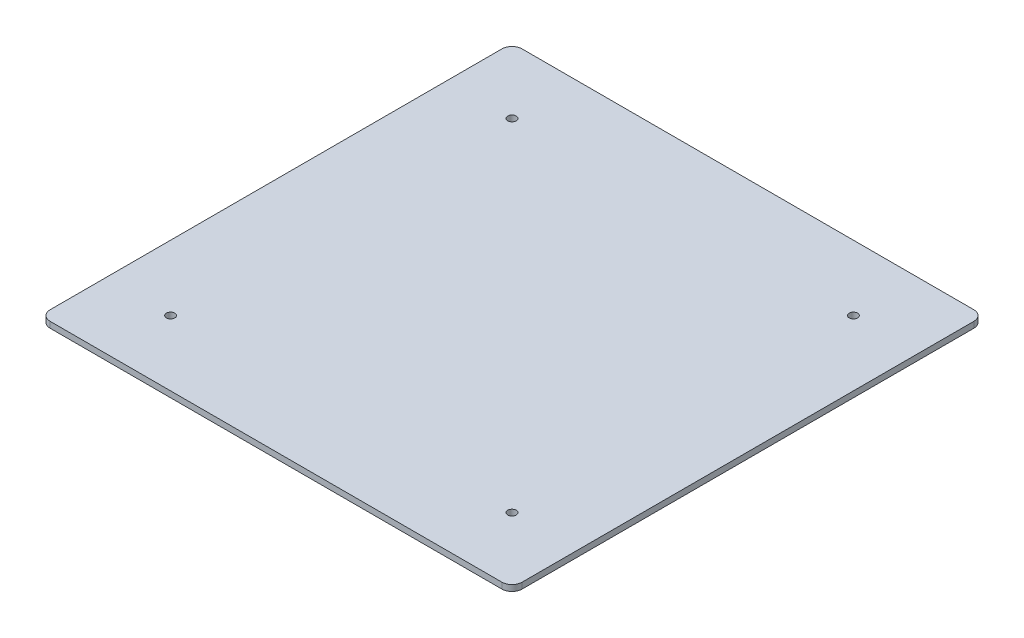
ISO-10303-21;
HEADER;
FILE_DESCRIPTION(('STEP AP214'),'2;1');
FILE_NAME('part.step','',(''),(''),'','','');
FILE_SCHEMA(('AUTOMOTIVE_DESIGN { 1 0 10303 214 1 1 1 1 }'));
ENDSEC;
DATA;
#1=APPLICATION_CONTEXT('core data for automotive mechanical design processes');
#2=APPLICATION_PROTOCOL_DEFINITION('international standard','automotive_design',2000,#1);
#3=PRODUCT_CONTEXT('',#1,'mechanical');
#4=PRODUCT('Part','Part','',(#3));
#5=PRODUCT_RELATED_PRODUCT_CATEGORY('part','',(#4));
#6=PRODUCT_DEFINITION_FORMATION('','',#4);
#7=PRODUCT_DEFINITION_CONTEXT('part definition',#1,'design');
#8=PRODUCT_DEFINITION('design','',#6,#7);
#9=PRODUCT_DEFINITION_SHAPE('','',#8);
#10=(LENGTH_UNIT() NAMED_UNIT(*) SI_UNIT(.MILLI.,.METRE.));
#11=(NAMED_UNIT(*) PLANE_ANGLE_UNIT() SI_UNIT($,.RADIAN.));
#12=(NAMED_UNIT(*) SI_UNIT($,.STERADIAN.) SOLID_ANGLE_UNIT());
#13=UNCERTAINTY_MEASURE_WITH_UNIT(LENGTH_MEASURE(1.E-05),#10,'distance_accuracy_value','');
#14=(GEOMETRIC_REPRESENTATION_CONTEXT(3) GLOBAL_UNCERTAINTY_ASSIGNED_CONTEXT((#13)) GLOBAL_UNIT_ASSIGNED_CONTEXT((#10,
#11,#12)) REPRESENTATION_CONTEXT('',''));
#15=CARTESIAN_POINT('',(0.,0.,0.));
#16=DIRECTION('',(0.,0.,1.));
#17=DIRECTION('',(1.,0.,0.));
#18=AXIS2_PLACEMENT_3D('',#15,#16,#17);
#19=CARTESIAN_POINT('',(0.,3.,117.5));
#20=DIRECTION('',(0.,0.,-1.));
#21=DIRECTION('',(-1.,0.,0.));
#22=AXIS2_PLACEMENT_3D('',#19,#20,#21);
#23=PLANE('',#22);
#24=DIRECTION('',(1.,0.,0.));
#25=VECTOR('',#24,1.);
#26=CARTESIAN_POINT('',(0.,3.,117.5));
#27=LINE('',#26,#25);
#28=CARTESIAN_POINT('',(-112.5,3.,117.5));
#29=VERTEX_POINT('',#28);
#30=CARTESIAN_POINT('',(112.5,3.,117.5));
#31=VERTEX_POINT('',#30);
#32=EDGE_CURVE('E125',#29,#31,#27,.T.);
#33=ORIENTED_EDGE('',*,*,#32,.F.);
#34=DIRECTION('',(0.,-1.,0.));
#35=VECTOR('',#34,1.);
#36=CARTESIAN_POINT('',(-112.5,0.,117.5));
#37=LINE('',#36,#35);
#38=CARTESIAN_POINT('',(-112.5,0.,117.5));
#39=VERTEX_POINT('',#38);
#40=EDGE_CURVE('E110',#29,#39,#37,.T.);
#41=ORIENTED_EDGE('',*,*,#40,.T.);
#42=DIRECTION('',(1.,0.,0.));
#43=VECTOR('',#42,1.);
#44=CARTESIAN_POINT('',(0.,0.,117.5));
#45=LINE('',#44,#43);
#46=CARTESIAN_POINT('',(112.5,0.,117.5));
#47=VERTEX_POINT('',#46);
#48=EDGE_CURVE('E122',#39,#47,#45,.T.);
#49=ORIENTED_EDGE('',*,*,#48,.T.);
#50=DIRECTION('',(0.,-1.,0.));
#51=VECTOR('',#50,1.);
#52=CARTESIAN_POINT('',(112.5,3.,117.5));
#53=LINE('',#52,#51);
#54=EDGE_CURVE('E127',#47,#31,#53,.F.);
#55=ORIENTED_EDGE('',*,*,#54,.T.);
#56=EDGE_LOOP('',(#33,#41,#49,#55));
#57=FACE_BOUND('',#56,.T.);
#58=ADVANCED_FACE('F40',(#57),#23,.F.);
#59=CARTESIAN_POINT('',(117.5,3.,0.));
#60=DIRECTION('',(-1.,0.,0.));
#61=DIRECTION('',(0.,0.,1.));
#62=AXIS2_PLACEMENT_3D('',#59,#60,#61);
#63=PLANE('',#62);
#64=DIRECTION('',(0.,0.,-1.));
#65=VECTOR('',#64,1.);
#66=CARTESIAN_POINT('',(117.5,0.,0.));
#67=LINE('',#66,#65);
#68=CARTESIAN_POINT('',(117.5,0.,112.5));
#69=VERTEX_POINT('',#68);
#70=CARTESIAN_POINT('',(117.5,0.,-112.5));
#71=VERTEX_POINT('',#70);
#72=EDGE_CURVE('E131',#69,#71,#67,.T.);
#73=ORIENTED_EDGE('',*,*,#72,.T.);
#74=DIRECTION('',(0.,-1.,0.));
#75=VECTOR('',#74,1.);
#76=CARTESIAN_POINT('',(117.5,3.,-112.5));
#77=LINE('',#76,#75);
#78=CARTESIAN_POINT('',(117.5,3.,-112.5));
#79=VERTEX_POINT('',#78);
#80=EDGE_CURVE('E11',#71,#79,#77,.F.);
#81=ORIENTED_EDGE('',*,*,#80,.T.);
#82=DIRECTION('',(0.,0.,-1.));
#83=VECTOR('',#82,1.);
#84=CARTESIAN_POINT('',(117.5,3.,0.));
#85=LINE('',#84,#83);
#86=CARTESIAN_POINT('',(117.5,3.,112.5));
#87=VERTEX_POINT('',#86);
#88=EDGE_CURVE('E172',#87,#79,#85,.T.);
#89=ORIENTED_EDGE('',*,*,#88,.F.);
#90=DIRECTION('',(0.,-1.,0.));
#91=VECTOR('',#90,1.);
#92=CARTESIAN_POINT('',(117.5,3.,112.5));
#93=LINE('',#92,#91);
#94=EDGE_CURVE('E48',#87,#69,#93,.T.);
#95=ORIENTED_EDGE('',*,*,#94,.T.);
#96=EDGE_LOOP('',(#73,#81,#89,#95));
#97=FACE_BOUND('',#96,.T.);
#98=ADVANCED_FACE('F170',(#97),#63,.F.);
#99=CARTESIAN_POINT('',(0.,3.,-117.5));
#100=DIRECTION('',(0.,0.,-1.));
#101=DIRECTION('',(-1.,0.,0.));
#102=AXIS2_PLACEMENT_3D('',#99,#100,#101);
#103=PLANE('',#102);
#104=DIRECTION('',(1.,0.,0.));
#105=VECTOR('',#104,1.);
#106=CARTESIAN_POINT('',(0.,0.,-117.5));
#107=LINE('',#106,#105);
#108=CARTESIAN_POINT('',(-112.5,0.,-117.5));
#109=VERTEX_POINT('',#108);
#110=CARTESIAN_POINT('',(112.5,0.,-117.5));
#111=VERTEX_POINT('',#110);
#112=EDGE_CURVE('E135',#109,#111,#107,.T.);
#113=ORIENTED_EDGE('',*,*,#112,.F.);
#114=DIRECTION('',(0.,-1.,0.));
#115=VECTOR('',#114,1.);
#116=CARTESIAN_POINT('',(-112.5,3.,-117.5));
#117=LINE('',#116,#115);
#118=CARTESIAN_POINT('',(-112.5,3.,-117.5));
#119=VERTEX_POINT('',#118);
#120=EDGE_CURVE('E62',#109,#119,#117,.F.);
#121=ORIENTED_EDGE('',*,*,#120,.T.);
#122=DIRECTION('',(1.,0.,0.));
#123=VECTOR('',#122,1.);
#124=CARTESIAN_POINT('',(0.,3.,-117.5));
#125=LINE('',#124,#123);
#126=CARTESIAN_POINT('',(112.5,3.,-117.5));
#127=VERTEX_POINT('',#126);
#128=EDGE_CURVE('E179',#119,#127,#125,.T.);
#129=ORIENTED_EDGE('',*,*,#128,.T.);
#130=DIRECTION('',(0.,-1.,0.));
#131=VECTOR('',#130,1.);
#132=CARTESIAN_POINT('',(112.5,0.,-117.5));
#133=LINE('',#132,#131);
#134=EDGE_CURVE('E163',#127,#111,#133,.T.);
#135=ORIENTED_EDGE('',*,*,#134,.T.);
#136=EDGE_LOOP('',(#113,#121,#129,#135));
#137=FACE_BOUND('',#136,.T.);
#138=ADVANCED_FACE('F178',(#137),#103,.T.);
#139=CARTESIAN_POINT('',(-117.5,3.,0.));
#140=DIRECTION('',(-1.,0.,0.));
#141=DIRECTION('',(0.,0.,1.));
#142=AXIS2_PLACEMENT_3D('',#139,#140,#141);
#143=PLANE('',#142);
#144=DIRECTION('',(0.,0.,-1.));
#145=VECTOR('',#144,1.);
#146=CARTESIAN_POINT('',(-117.5,0.,0.));
#147=LINE('',#146,#145);
#148=CARTESIAN_POINT('',(-117.5,0.,112.5));
#149=VERTEX_POINT('',#148);
#150=CARTESIAN_POINT('',(-117.5,0.,-112.5));
#151=VERTEX_POINT('',#150);
#152=EDGE_CURVE('E146',#149,#151,#147,.T.);
#153=ORIENTED_EDGE('',*,*,#152,.F.);
#154=DIRECTION('',(0.,-1.,0.));
#155=VECTOR('',#154,1.);
#156=CARTESIAN_POINT('',(-117.5,3.,112.5));
#157=LINE('',#156,#155);
#158=CARTESIAN_POINT('',(-117.5,3.,112.5));
#159=VERTEX_POINT('',#158);
#160=EDGE_CURVE('E111',#149,#159,#157,.F.);
#161=ORIENTED_EDGE('',*,*,#160,.T.);
#162=DIRECTION('',(0.,0.,-1.));
#163=VECTOR('',#162,1.);
#164=CARTESIAN_POINT('',(-117.5,3.,0.));
#165=LINE('',#164,#163);
#166=CARTESIAN_POINT('',(-117.5,3.,-112.5));
#167=VERTEX_POINT('',#166);
#168=EDGE_CURVE('E141',#159,#167,#165,.T.);
#169=ORIENTED_EDGE('',*,*,#168,.T.);
#170=DIRECTION('',(0.,-1.,0.));
#171=VECTOR('',#170,1.);
#172=CARTESIAN_POINT('',(-117.5,3.,-112.5));
#173=LINE('',#172,#171);
#174=EDGE_CURVE('E116',#167,#151,#173,.T.);
#175=ORIENTED_EDGE('',*,*,#174,.T.);
#176=EDGE_LOOP('',(#153,#161,#169,#175));
#177=FACE_BOUND('',#176,.T.);
#178=ADVANCED_FACE('F251',(#177),#143,.T.);
#179=CARTESIAN_POINT('',(0.,3.,0.));
#180=DIRECTION('',(0.,1.,0.));
#181=DIRECTION('',(0.,0.,1.));
#182=AXIS2_PLACEMENT_3D('',#179,#180,#181);
#183=PLANE('',#182);
#184=CARTESIAN_POINT('',(-85.,3.,-85.));
#185=DIRECTION('',(0.,-1.,0.));
#186=DIRECTION('',(0.,0.,-1.));
#187=AXIS2_PLACEMENT_3D('',#184,#185,#186);
#188=CIRCLE('',#187,2.1);
#189=CARTESIAN_POINT('',(-85.,3.,-87.1));
#190=VERTEX_POINT('',#189);
#191=EDGE_CURVE('E188',#190,#190,#188,.T.);
#192=ORIENTED_EDGE('',*,*,#191,.T.);
#193=EDGE_LOOP('',(#192));
#194=FACE_BOUND('',#193,.T.);
#195=CARTESIAN_POINT('',(85.,3.,85.));
#196=DIRECTION('',(0.,-1.,0.));
#197=DIRECTION('',(0.,0.,-1.));
#198=AXIS2_PLACEMENT_3D('',#195,#196,#197);
#199=CIRCLE('',#198,2.1);
#200=CARTESIAN_POINT('',(85.,3.,82.9));
#201=VERTEX_POINT('',#200);
#202=EDGE_CURVE('E194',#201,#201,#199,.T.);
#203=ORIENTED_EDGE('',*,*,#202,.T.);
#204=EDGE_LOOP('',(#203));
#205=FACE_BOUND('',#204,.T.);
#206=CARTESIAN_POINT('',(-85.,3.,85.));
#207=DIRECTION('',(0.,-1.,0.));
#208=DIRECTION('',(0.,0.,-1.));
#209=AXIS2_PLACEMENT_3D('',#206,#207,#208);
#210=CIRCLE('',#209,2.1);
#211=CARTESIAN_POINT('',(-85.,3.,82.9));
#212=VERTEX_POINT('',#211);
#213=EDGE_CURVE('E200',#212,#212,#210,.T.);
#214=ORIENTED_EDGE('',*,*,#213,.T.);
#215=EDGE_LOOP('',(#214));
#216=FACE_BOUND('',#215,.T.);
#217=CARTESIAN_POINT('',(85.,3.,-85.));
#218=DIRECTION('',(0.,-1.,0.));
#219=DIRECTION('',(0.,0.,-1.));
#220=AXIS2_PLACEMENT_3D('',#217,#218,#219);
#221=CIRCLE('',#220,2.1);
#222=CARTESIAN_POINT('',(85.,3.,-87.1));
#223=VERTEX_POINT('',#222);
#224=EDGE_CURVE('E132',#223,#223,#221,.T.);
#225=ORIENTED_EDGE('',*,*,#224,.T.);
#226=EDGE_LOOP('',(#225));
#227=FACE_BOUND('',#226,.T.);
#228=ORIENTED_EDGE('',*,*,#168,.F.);
#229=CARTESIAN_POINT('',(-112.5,3.,112.5));
#230=DIRECTION('',(0.,1.,0.));
#231=DIRECTION('',(0.,0.,1.));
#232=AXIS2_PLACEMENT_3D('',#229,#230,#231);
#233=CIRCLE('',#232,5.);
#234=EDGE_CURVE('E161',#159,#29,#233,.T.);
#235=ORIENTED_EDGE('',*,*,#234,.T.);
#236=ORIENTED_EDGE('',*,*,#32,.T.);
#237=CARTESIAN_POINT('',(112.5,3.,112.5));
#238=DIRECTION('',(0.,1.,0.));
#239=DIRECTION('',(0.,0.,1.));
#240=AXIS2_PLACEMENT_3D('',#237,#238,#239);
#241=CIRCLE('',#240,5.);
#242=EDGE_CURVE('E156',#31,#87,#241,.T.);
#243=ORIENTED_EDGE('',*,*,#242,.T.);
#244=ORIENTED_EDGE('',*,*,#88,.T.);
#245=CARTESIAN_POINT('',(112.5,3.,-112.5));
#246=DIRECTION('',(0.,1.,0.));
#247=DIRECTION('',(0.,0.,1.));
#248=AXIS2_PLACEMENT_3D('',#245,#246,#247);
#249=CIRCLE('',#248,5.);
#250=EDGE_CURVE('E55',#79,#127,#249,.T.);
#251=ORIENTED_EDGE('',*,*,#250,.T.);
#252=ORIENTED_EDGE('',*,*,#128,.F.);
#253=CARTESIAN_POINT('',(-112.5,3.,-112.5));
#254=DIRECTION('',(0.,1.,0.));
#255=DIRECTION('',(0.,0.,1.));
#256=AXIS2_PLACEMENT_3D('',#253,#254,#255);
#257=CIRCLE('',#256,5.);
#258=EDGE_CURVE('E159',#119,#167,#257,.T.);
#259=ORIENTED_EDGE('',*,*,#258,.T.);
#260=EDGE_LOOP('',(#228,#235,#236,#243,#244,#251,#252,#259));
#261=FACE_BOUND('',#260,.T.);
#262=ADVANCED_FACE('F211',(#194,#205,#216,#227,#261),#183,.T.);
#263=CARTESIAN_POINT('',(0.,0.,0.));
#264=DIRECTION('',(0.,1.,0.));
#265=DIRECTION('',(0.,0.,1.));
#266=AXIS2_PLACEMENT_3D('',#263,#264,#265);
#267=PLANE('',#266);
#268=CARTESIAN_POINT('',(-85.,0.,-85.));
#269=DIRECTION('',(0.,-1.,0.));
#270=DIRECTION('',(0.,0.,-1.));
#271=AXIS2_PLACEMENT_3D('',#268,#269,#270);
#272=CIRCLE('',#271,2.1);
#273=CARTESIAN_POINT('',(-85.,0.,-87.1));
#274=VERTEX_POINT('',#273);
#275=EDGE_CURVE('E191',#274,#274,#272,.T.);
#276=ORIENTED_EDGE('',*,*,#275,.F.);
#277=EDGE_LOOP('',(#276));
#278=FACE_BOUND('',#277,.T.);
#279=CARTESIAN_POINT('',(85.,0.,85.));
#280=DIRECTION('',(0.,-1.,0.));
#281=DIRECTION('',(0.,0.,-1.));
#282=AXIS2_PLACEMENT_3D('',#279,#280,#281);
#283=CIRCLE('',#282,2.1);
#284=CARTESIAN_POINT('',(85.,0.,82.9));
#285=VERTEX_POINT('',#284);
#286=EDGE_CURVE('E197',#285,#285,#283,.T.);
#287=ORIENTED_EDGE('',*,*,#286,.F.);
#288=EDGE_LOOP('',(#287));
#289=FACE_BOUND('',#288,.T.);
#290=CARTESIAN_POINT('',(-85.,0.,85.));
#291=DIRECTION('',(0.,-1.,0.));
#292=DIRECTION('',(0.,0.,-1.));
#293=AXIS2_PLACEMENT_3D('',#290,#291,#292);
#294=CIRCLE('',#293,2.1);
#295=CARTESIAN_POINT('',(-85.,0.,82.9));
#296=VERTEX_POINT('',#295);
#297=EDGE_CURVE('E186',#296,#296,#294,.T.);
#298=ORIENTED_EDGE('',*,*,#297,.F.);
#299=EDGE_LOOP('',(#298));
#300=FACE_BOUND('',#299,.T.);
#301=CARTESIAN_POINT('',(85.,0.,-85.));
#302=DIRECTION('',(0.,-1.,0.));
#303=DIRECTION('',(0.,0.,-1.));
#304=AXIS2_PLACEMENT_3D('',#301,#302,#303);
#305=CIRCLE('',#304,2.1);
#306=CARTESIAN_POINT('',(85.,0.,-87.1));
#307=VERTEX_POINT('',#306);
#308=EDGE_CURVE('E138',#307,#307,#305,.T.);
#309=ORIENTED_EDGE('',*,*,#308,.F.);
#310=EDGE_LOOP('',(#309));
#311=FACE_BOUND('',#310,.T.);
#312=ORIENTED_EDGE('',*,*,#48,.F.);
#313=CARTESIAN_POINT('',(-112.5,0.,112.5));
#314=DIRECTION('',(0.,1.,0.));
#315=DIRECTION('',(0.,0.,1.));
#316=AXIS2_PLACEMENT_3D('',#313,#314,#315);
#317=CIRCLE('',#316,5.);
#318=EDGE_CURVE('E106',#39,#149,#317,.F.);
#319=ORIENTED_EDGE('',*,*,#318,.T.);
#320=ORIENTED_EDGE('',*,*,#152,.T.);
#321=CARTESIAN_POINT('',(-112.5,0.,-112.5));
#322=DIRECTION('',(0.,1.,0.));
#323=DIRECTION('',(0.,0.,1.));
#324=AXIS2_PLACEMENT_3D('',#321,#322,#323);
#325=CIRCLE('',#324,5.);
#326=EDGE_CURVE('E117',#151,#109,#325,.F.);
#327=ORIENTED_EDGE('',*,*,#326,.T.);
#328=ORIENTED_EDGE('',*,*,#112,.T.);
#329=CARTESIAN_POINT('',(112.5,0.,-112.5));
#330=DIRECTION('',(0.,1.,0.));
#331=DIRECTION('',(0.,0.,1.));
#332=AXIS2_PLACEMENT_3D('',#329,#330,#331);
#333=CIRCLE('',#332,5.);
#334=EDGE_CURVE('E150',#111,#71,#333,.F.);
#335=ORIENTED_EDGE('',*,*,#334,.T.);
#336=ORIENTED_EDGE('',*,*,#72,.F.);
#337=CARTESIAN_POINT('',(112.5,0.,112.5));
#338=DIRECTION('',(0.,1.,0.));
#339=DIRECTION('',(0.,0.,1.));
#340=AXIS2_PLACEMENT_3D('',#337,#338,#339);
#341=CIRCLE('',#340,5.);
#342=EDGE_CURVE('E126',#69,#47,#341,.F.);
#343=ORIENTED_EDGE('',*,*,#342,.T.);
#344=EDGE_LOOP('',(#312,#319,#320,#327,#328,#335,#336,#343));
#345=FACE_BOUND('',#344,.T.);
#346=ADVANCED_FACE('F129',(#278,#289,#300,#311,#345),#267,.F.);
#347=CARTESIAN_POINT('',(85.,3.,-85.));
#348=DIRECTION('',(0.,-1.,0.));
#349=DIRECTION('',(0.,0.,-1.));
#350=AXIS2_PLACEMENT_3D('',#347,#348,#349);
#351=CYLINDRICAL_SURFACE('',#350,2.1);
#352=ORIENTED_EDGE('',*,*,#224,.F.);
#353=EDGE_LOOP('',(#352));
#354=FACE_BOUND('',#353,.T.);
#355=ORIENTED_EDGE('',*,*,#308,.T.);
#356=EDGE_LOOP('',(#355));
#357=FACE_BOUND('',#356,.T.);
#358=ADVANCED_FACE('F210',(#354,#357),#351,.F.);
#359=CARTESIAN_POINT('',(-85.,3.,85.));
#360=DIRECTION('',(0.,-1.,0.));
#361=DIRECTION('',(0.,0.,-1.));
#362=AXIS2_PLACEMENT_3D('',#359,#360,#361);
#363=CYLINDRICAL_SURFACE('',#362,2.1);
#364=ORIENTED_EDGE('',*,*,#213,.F.);
#365=EDGE_LOOP('',(#364));
#366=FACE_BOUND('',#365,.T.);
#367=ORIENTED_EDGE('',*,*,#297,.T.);
#368=EDGE_LOOP('',(#367));
#369=FACE_BOUND('',#368,.T.);
#370=ADVANCED_FACE('F206',(#366,#369),#363,.F.);
#371=CARTESIAN_POINT('',(85.,3.,85.));
#372=DIRECTION('',(0.,-1.,0.));
#373=DIRECTION('',(0.,0.,-1.));
#374=AXIS2_PLACEMENT_3D('',#371,#372,#373);
#375=CYLINDRICAL_SURFACE('',#374,2.1);
#376=ORIENTED_EDGE('',*,*,#202,.F.);
#377=EDGE_LOOP('',(#376));
#378=FACE_BOUND('',#377,.T.);
#379=ORIENTED_EDGE('',*,*,#286,.T.);
#380=EDGE_LOOP('',(#379));
#381=FACE_BOUND('',#380,.T.);
#382=ADVANCED_FACE('F222',(#378,#381),#375,.F.);
#383=CARTESIAN_POINT('',(-85.,3.,-85.));
#384=DIRECTION('',(0.,-1.,0.));
#385=DIRECTION('',(0.,0.,-1.));
#386=AXIS2_PLACEMENT_3D('',#383,#384,#385);
#387=CYLINDRICAL_SURFACE('',#386,2.1);
#388=ORIENTED_EDGE('',*,*,#191,.F.);
#389=EDGE_LOOP('',(#388));
#390=FACE_BOUND('',#389,.T.);
#391=ORIENTED_EDGE('',*,*,#275,.T.);
#392=EDGE_LOOP('',(#391));
#393=FACE_BOUND('',#392,.T.);
#394=ADVANCED_FACE('F239',(#390,#393),#387,.F.);
#395=CARTESIAN_POINT('',(-112.5,3.,112.5));
#396=DIRECTION('',(0.,1.,0.));
#397=DIRECTION('',(0.,0.,1.));
#398=AXIS2_PLACEMENT_3D('',#395,#396,#397);
#399=CYLINDRICAL_SURFACE('',#398,5.);
#400=ORIENTED_EDGE('',*,*,#234,.F.);
#401=ORIENTED_EDGE('',*,*,#160,.F.);
#402=ORIENTED_EDGE('',*,*,#318,.F.);
#403=ORIENTED_EDGE('',*,*,#40,.F.);
#404=EDGE_LOOP('',(#400,#401,#402,#403));
#405=FACE_BOUND('',#404,.T.);
#406=ADVANCED_FACE('F109',(#405),#399,.T.);
#407=CARTESIAN_POINT('',(-112.5,3.,-112.5));
#408=DIRECTION('',(0.,-1.,0.));
#409=DIRECTION('',(0.,0.,-1.));
#410=AXIS2_PLACEMENT_3D('',#407,#408,#409);
#411=CYLINDRICAL_SURFACE('',#410,5.);
#412=ORIENTED_EDGE('',*,*,#258,.F.);
#413=ORIENTED_EDGE('',*,*,#120,.F.);
#414=ORIENTED_EDGE('',*,*,#326,.F.);
#415=ORIENTED_EDGE('',*,*,#174,.F.);
#416=EDGE_LOOP('',(#412,#413,#414,#415));
#417=FACE_BOUND('',#416,.T.);
#418=ADVANCED_FACE('F238',(#417),#411,.T.);
#419=CARTESIAN_POINT('',(112.5,3.,-112.5));
#420=DIRECTION('',(0.,1.,0.));
#421=DIRECTION('',(0.,0.,1.));
#422=AXIS2_PLACEMENT_3D('',#419,#420,#421);
#423=CYLINDRICAL_SURFACE('',#422,5.);
#424=ORIENTED_EDGE('',*,*,#250,.F.);
#425=ORIENTED_EDGE('',*,*,#80,.F.);
#426=ORIENTED_EDGE('',*,*,#334,.F.);
#427=ORIENTED_EDGE('',*,*,#134,.F.);
#428=EDGE_LOOP('',(#424,#425,#426,#427));
#429=FACE_BOUND('',#428,.T.);
#430=ADVANCED_FACE('F177',(#429),#423,.T.);
#431=CARTESIAN_POINT('',(112.5,3.,112.5));
#432=DIRECTION('',(0.,-1.,0.));
#433=DIRECTION('',(0.,0.,-1.));
#434=AXIS2_PLACEMENT_3D('',#431,#432,#433);
#435=CYLINDRICAL_SURFACE('',#434,5.);
#436=ORIENTED_EDGE('',*,*,#242,.F.);
#437=ORIENTED_EDGE('',*,*,#54,.F.);
#438=ORIENTED_EDGE('',*,*,#342,.F.);
#439=ORIENTED_EDGE('',*,*,#94,.F.);
#440=EDGE_LOOP('',(#436,#437,#438,#439));
#441=FACE_BOUND('',#440,.T.);
#442=ADVANCED_FACE('F42',(#441),#435,.T.);
#443=CLOSED_SHELL('',(#58,#98,#138,#178,#262,#346,#358,#370,#382,#394,#406,#418,#430,#442));
#444=MANIFOLD_SOLID_BREP('B2',#443);
#445=ADVANCED_BREP_SHAPE_REPRESENTATION('',(#18,#444),#14);
#446=SHAPE_DEFINITION_REPRESENTATION(#9,#445);
ENDSEC;
END-ISO-10303-21;
